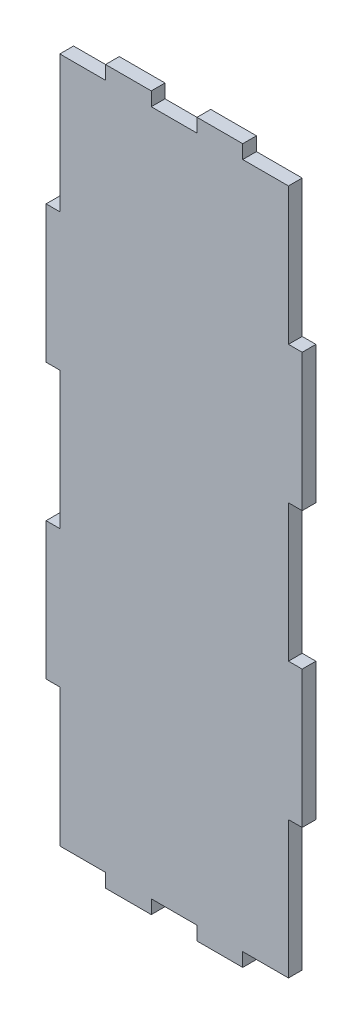
ISO-10303-21;
HEADER;
FILE_DESCRIPTION(('STEP AP214'),'2;1');
FILE_NAME('part.step','',(''),(''),'','','');
FILE_SCHEMA(('AUTOMOTIVE_DESIGN { 1 0 10303 214 1 1 1 1 }'));
ENDSEC;
DATA;
#1=APPLICATION_CONTEXT('core data for automotive mechanical design processes');
#2=APPLICATION_PROTOCOL_DEFINITION('international standard','automotive_design',2000,#1);
#3=PRODUCT_CONTEXT('',#1,'mechanical');
#4=PRODUCT('Part','Part','',(#3));
#5=PRODUCT_RELATED_PRODUCT_CATEGORY('part','',(#4));
#6=PRODUCT_DEFINITION_FORMATION('','',#4);
#7=PRODUCT_DEFINITION_CONTEXT('part definition',#1,'design');
#8=PRODUCT_DEFINITION('design','',#6,#7);
#9=PRODUCT_DEFINITION_SHAPE('','',#8);
#10=(LENGTH_UNIT() NAMED_UNIT(*) SI_UNIT(.MILLI.,.METRE.));
#11=(NAMED_UNIT(*) PLANE_ANGLE_UNIT() SI_UNIT($,.RADIAN.));
#12=(NAMED_UNIT(*) SI_UNIT($,.STERADIAN.) SOLID_ANGLE_UNIT());
#13=UNCERTAINTY_MEASURE_WITH_UNIT(LENGTH_MEASURE(1.E-05),#10,'distance_accuracy_value','');
#14=(GEOMETRIC_REPRESENTATION_CONTEXT(3) GLOBAL_UNCERTAINTY_ASSIGNED_CONTEXT((#13)) GLOBAL_UNIT_ASSIGNED_CONTEXT((#10,
#11,#12)) REPRESENTATION_CONTEXT('',''));
#15=CARTESIAN_POINT('',(0.,0.,0.));
#16=DIRECTION('',(0.,0.,1.));
#17=DIRECTION('',(1.,0.,0.));
#18=AXIS2_PLACEMENT_3D('',#15,#16,#17);
#19=CARTESIAN_POINT('',(40.,-110.677979206516,3.));
#20=DIRECTION('',(0.,1.,0.));
#21=DIRECTION('',(-1.,0.,0.));
#22=AXIS2_PLACEMENT_3D('',#19,#20,#21);
#23=PLANE('',#22);
#24=DIRECTION('',(1.,0.,0.));
#25=VECTOR('',#24,1.);
#26=CARTESIAN_POINT('',(40.,-110.677979206516,0.));
#27=LINE('',#26,#25);
#28=CARTESIAN_POINT('',(30.,-110.677979206516,0.));
#29=VERTEX_POINT('',#28);
#30=CARTESIAN_POINT('',(40.,-110.677979206516,0.));
#31=VERTEX_POINT('',#30);
#32=EDGE_CURVE('E302',#29,#31,#27,.T.);
#33=ORIENTED_EDGE('',*,*,#32,.T.);
#34=DIRECTION('',(0.,0.,-1.));
#35=VECTOR('',#34,1.);
#36=CARTESIAN_POINT('',(40.,-110.677979206516,3.));
#37=LINE('',#36,#35);
#38=CARTESIAN_POINT('',(40.,-110.677979206516,3.));
#39=VERTEX_POINT('',#38);
#40=EDGE_CURVE('E11',#39,#31,#37,.T.);
#41=ORIENTED_EDGE('',*,*,#40,.F.);
#42=DIRECTION('',(1.,0.,0.));
#43=VECTOR('',#42,1.);
#44=CARTESIAN_POINT('',(40.,-110.677979206516,3.));
#45=LINE('',#44,#43);
#46=CARTESIAN_POINT('',(30.,-110.677979206516,3.));
#47=VERTEX_POINT('',#46);
#48=EDGE_CURVE('E372',#47,#39,#45,.T.);
#49=ORIENTED_EDGE('',*,*,#48,.F.);
#50=DIRECTION('',(0.,0.,-1.));
#51=VECTOR('',#50,1.);
#52=CARTESIAN_POINT('',(30.,-110.677979206516,3.));
#53=LINE('',#52,#51);
#54=EDGE_CURVE('E298',#47,#29,#53,.T.);
#55=ORIENTED_EDGE('',*,*,#54,.T.);
#56=EDGE_LOOP('',(#33,#41,#49,#55));
#57=FACE_BOUND('',#56,.T.);
#58=ADVANCED_FACE('F38',(#57),#23,.F.);
#59=CARTESIAN_POINT('',(40.,-80.6779792065165,3.));
#60=DIRECTION('',(-1.,0.,0.));
#61=DIRECTION('',(0.,0.,1.));
#62=AXIS2_PLACEMENT_3D('',#59,#60,#61);
#63=PLANE('',#62);
#64=DIRECTION('',(0.,1.,0.));
#65=VECTOR('',#64,1.);
#66=CARTESIAN_POINT('',(40.,-80.6779792065165,0.));
#67=LINE('',#66,#65);
#68=CARTESIAN_POINT('',(40.,-80.6779792065165,0.));
#69=VERTEX_POINT('',#68);
#70=EDGE_CURVE('E305',#31,#69,#67,.T.);
#71=ORIENTED_EDGE('',*,*,#70,.T.);
#72=DIRECTION('',(0.,0.,-1.));
#73=VECTOR('',#72,1.);
#74=CARTESIAN_POINT('',(40.,-80.6779792065165,3.));
#75=LINE('',#74,#73);
#76=CARTESIAN_POINT('',(40.,-80.6779792065165,3.));
#77=VERTEX_POINT('',#76);
#78=EDGE_CURVE('E46',#77,#69,#75,.T.);
#79=ORIENTED_EDGE('',*,*,#78,.F.);
#80=DIRECTION('',(0.,1.,0.));
#81=VECTOR('',#80,1.);
#82=CARTESIAN_POINT('',(40.,-80.6779792065165,3.));
#83=LINE('',#82,#81);
#84=EDGE_CURVE('E181',#39,#77,#83,.T.);
#85=ORIENTED_EDGE('',*,*,#84,.F.);
#86=ORIENTED_EDGE('',*,*,#40,.T.);
#87=EDGE_LOOP('',(#71,#79,#85,#86));
#88=FACE_BOUND('',#87,.T.);
#89=ADVANCED_FACE('F570',(#88),#63,.F.);
#90=CARTESIAN_POINT('',(40.,-80.6779792065165,3.));
#91=DIRECTION('',(0.,1.,0.));
#92=DIRECTION('',(0.,0.,1.));
#93=AXIS2_PLACEMENT_3D('',#90,#91,#92);
#94=PLANE('',#93);
#95=DIRECTION('',(1.,0.,0.));
#96=VECTOR('',#95,1.);
#97=CARTESIAN_POINT('',(40.,-80.6779792065165,0.));
#98=LINE('',#97,#96);
#99=CARTESIAN_POINT('',(43.,-80.6779792065165,0.));
#100=VERTEX_POINT('',#99);
#101=EDGE_CURVE('E307',#69,#100,#98,.T.);
#102=ORIENTED_EDGE('',*,*,#101,.T.);
#103=DIRECTION('',(0.,0.,-1.));
#104=VECTOR('',#103,1.);
#105=CARTESIAN_POINT('',(43.,-80.6779792065165,3.));
#106=LINE('',#105,#104);
#107=CARTESIAN_POINT('',(43.,-80.6779792065165,3.));
#108=VERTEX_POINT('',#107);
#109=EDGE_CURVE('E463',#108,#100,#106,.T.);
#110=ORIENTED_EDGE('',*,*,#109,.F.);
#111=DIRECTION('',(1.,0.,0.));
#112=VECTOR('',#111,1.);
#113=CARTESIAN_POINT('',(40.,-80.6779792065165,3.));
#114=LINE('',#113,#112);
#115=EDGE_CURVE('E471',#77,#108,#114,.T.);
#116=ORIENTED_EDGE('',*,*,#115,.F.);
#117=ORIENTED_EDGE('',*,*,#78,.T.);
#118=EDGE_LOOP('',(#102,#110,#116,#117));
#119=FACE_BOUND('',#118,.T.);
#120=ADVANCED_FACE('F469',(#119),#94,.F.);
#121=CARTESIAN_POINT('',(43.,-80.6779792065165,3.));
#122=DIRECTION('',(-1.,0.,0.));
#123=DIRECTION('',(0.,-1.,0.));
#124=AXIS2_PLACEMENT_3D('',#121,#122,#123);
#125=PLANE('',#124);
#126=DIRECTION('',(0.,1.,0.));
#127=VECTOR('',#126,1.);
#128=CARTESIAN_POINT('',(43.,-80.6779792065165,0.));
#129=LINE('',#128,#127);
#130=CARTESIAN_POINT('',(43.,-50.6779792065165,0.));
#131=VERTEX_POINT('',#130);
#132=EDGE_CURVE('E309',#100,#131,#129,.T.);
#133=ORIENTED_EDGE('',*,*,#132,.T.);
#134=DIRECTION('',(0.,0.,-1.));
#135=VECTOR('',#134,1.);
#136=CARTESIAN_POINT('',(43.,-50.6779792065165,3.));
#137=LINE('',#136,#135);
#138=CARTESIAN_POINT('',(43.,-50.6779792065165,3.));
#139=VERTEX_POINT('',#138);
#140=EDGE_CURVE('E460',#139,#131,#137,.T.);
#141=ORIENTED_EDGE('',*,*,#140,.F.);
#142=DIRECTION('',(0.,1.,0.));
#143=VECTOR('',#142,1.);
#144=CARTESIAN_POINT('',(43.,-80.6779792065165,3.));
#145=LINE('',#144,#143);
#146=EDGE_CURVE('E489',#108,#139,#145,.T.);
#147=ORIENTED_EDGE('',*,*,#146,.F.);
#148=ORIENTED_EDGE('',*,*,#109,.T.);
#149=EDGE_LOOP('',(#133,#141,#147,#148));
#150=FACE_BOUND('',#149,.T.);
#151=ADVANCED_FACE('F480',(#150),#125,.F.);
#152=CARTESIAN_POINT('',(40.,-50.6779792065165,3.));
#153=DIRECTION('',(0.,-1.,0.));
#154=DIRECTION('',(0.,0.,-1.));
#155=AXIS2_PLACEMENT_3D('',#152,#153,#154);
#156=PLANE('',#155);
#157=DIRECTION('',(-1.,0.,0.));
#158=VECTOR('',#157,1.);
#159=CARTESIAN_POINT('',(40.,-50.6779792065165,0.));
#160=LINE('',#159,#158);
#161=CARTESIAN_POINT('',(40.,-50.6779792065165,0.));
#162=VERTEX_POINT('',#161);
#163=EDGE_CURVE('E311',#131,#162,#160,.T.);
#164=ORIENTED_EDGE('',*,*,#163,.T.);
#165=DIRECTION('',(0.,0.,-1.));
#166=VECTOR('',#165,1.);
#167=CARTESIAN_POINT('',(40.,-50.6779792065165,3.));
#168=LINE('',#167,#166);
#169=CARTESIAN_POINT('',(40.,-50.6779792065165,3.));
#170=VERTEX_POINT('',#169);
#171=EDGE_CURVE('E457',#170,#162,#168,.T.);
#172=ORIENTED_EDGE('',*,*,#171,.F.);
#173=DIRECTION('',(-1.,0.,0.));
#174=VECTOR('',#173,1.);
#175=CARTESIAN_POINT('',(40.,-50.6779792065165,3.));
#176=LINE('',#175,#174);
#177=EDGE_CURVE('E486',#139,#170,#176,.T.);
#178=ORIENTED_EDGE('',*,*,#177,.F.);
#179=ORIENTED_EDGE('',*,*,#140,.T.);
#180=EDGE_LOOP('',(#164,#172,#178,#179));
#181=FACE_BOUND('',#180,.T.);
#182=ADVANCED_FACE('F484',(#181),#156,.F.);
#183=CARTESIAN_POINT('',(40.,-20.6779792065165,3.));
#184=DIRECTION('',(-1.,0.,0.));
#185=DIRECTION('',(0.,0.,1.));
#186=AXIS2_PLACEMENT_3D('',#183,#184,#185);
#187=PLANE('',#186);
#188=DIRECTION('',(0.,1.,0.));
#189=VECTOR('',#188,1.);
#190=CARTESIAN_POINT('',(40.,-20.6779792065165,0.));
#191=LINE('',#190,#189);
#192=CARTESIAN_POINT('',(40.,-20.6779792065165,0.));
#193=VERTEX_POINT('',#192);
#194=EDGE_CURVE('E313',#162,#193,#191,.T.);
#195=ORIENTED_EDGE('',*,*,#194,.T.);
#196=DIRECTION('',(0.,0.,-1.));
#197=VECTOR('',#196,1.);
#198=CARTESIAN_POINT('',(40.,-20.6779792065165,3.));
#199=LINE('',#198,#197);
#200=CARTESIAN_POINT('',(40.,-20.6779792065165,3.));
#201=VERTEX_POINT('',#200);
#202=EDGE_CURVE('E454',#201,#193,#199,.T.);
#203=ORIENTED_EDGE('',*,*,#202,.F.);
#204=DIRECTION('',(0.,1.,0.));
#205=VECTOR('',#204,1.);
#206=CARTESIAN_POINT('',(40.,-20.6779792065165,3.));
#207=LINE('',#206,#205);
#208=EDGE_CURVE('E488',#170,#201,#207,.T.);
#209=ORIENTED_EDGE('',*,*,#208,.F.);
#210=ORIENTED_EDGE('',*,*,#171,.T.);
#211=EDGE_LOOP('',(#195,#203,#209,#210));
#212=FACE_BOUND('',#211,.T.);
#213=ADVANCED_FACE('F583',(#212),#187,.F.);
#214=CARTESIAN_POINT('',(40.,-20.6779792065165,3.));
#215=DIRECTION('',(0.,1.,0.));
#216=DIRECTION('',(0.,0.,1.));
#217=AXIS2_PLACEMENT_3D('',#214,#215,#216);
#218=PLANE('',#217);
#219=DIRECTION('',(1.,0.,0.));
#220=VECTOR('',#219,1.);
#221=CARTESIAN_POINT('',(40.,-20.6779792065165,0.));
#222=LINE('',#221,#220);
#223=CARTESIAN_POINT('',(43.,-20.6779792065165,0.));
#224=VERTEX_POINT('',#223);
#225=EDGE_CURVE('E315',#193,#224,#222,.T.);
#226=ORIENTED_EDGE('',*,*,#225,.T.);
#227=DIRECTION('',(0.,0.,-1.));
#228=VECTOR('',#227,1.);
#229=CARTESIAN_POINT('',(43.,-20.6779792065165,3.));
#230=LINE('',#229,#228);
#231=CARTESIAN_POINT('',(43.,-20.6779792065165,3.));
#232=VERTEX_POINT('',#231);
#233=EDGE_CURVE('E451',#232,#224,#230,.T.);
#234=ORIENTED_EDGE('',*,*,#233,.F.);
#235=DIRECTION('',(1.,0.,0.));
#236=VECTOR('',#235,1.);
#237=CARTESIAN_POINT('',(40.,-20.6779792065165,3.));
#238=LINE('',#237,#236);
#239=EDGE_CURVE('E491',#201,#232,#238,.T.);
#240=ORIENTED_EDGE('',*,*,#239,.F.);
#241=ORIENTED_EDGE('',*,*,#202,.T.);
#242=EDGE_LOOP('',(#226,#234,#240,#241));
#243=FACE_BOUND('',#242,.T.);
#244=ADVANCED_FACE('F586',(#243),#218,.F.);
#245=CARTESIAN_POINT('',(43.,-20.6779792065165,3.));
#246=DIRECTION('',(-1.,0.,0.));
#247=DIRECTION('',(0.,-1.,0.));
#248=AXIS2_PLACEMENT_3D('',#245,#246,#247);
#249=PLANE('',#248);
#250=DIRECTION('',(0.,1.,0.));
#251=VECTOR('',#250,1.);
#252=CARTESIAN_POINT('',(43.,-20.6779792065165,0.));
#253=LINE('',#252,#251);
#254=CARTESIAN_POINT('',(43.,9.32202079348354,0.));
#255=VERTEX_POINT('',#254);
#256=EDGE_CURVE('E317',#224,#255,#253,.T.);
#257=ORIENTED_EDGE('',*,*,#256,.T.);
#258=DIRECTION('',(0.,0.,-1.));
#259=VECTOR('',#258,1.);
#260=CARTESIAN_POINT('',(43.,9.32202079348354,3.));
#261=LINE('',#260,#259);
#262=CARTESIAN_POINT('',(43.,9.32202079348354,3.));
#263=VERTEX_POINT('',#262);
#264=EDGE_CURVE('E448',#263,#255,#261,.T.);
#265=ORIENTED_EDGE('',*,*,#264,.F.);
#266=DIRECTION('',(0.,1.,0.));
#267=VECTOR('',#266,1.);
#268=CARTESIAN_POINT('',(43.,-20.6779792065165,3.));
#269=LINE('',#268,#267);
#270=EDGE_CURVE('E497',#232,#263,#269,.T.);
#271=ORIENTED_EDGE('',*,*,#270,.F.);
#272=ORIENTED_EDGE('',*,*,#233,.T.);
#273=EDGE_LOOP('',(#257,#265,#271,#272));
#274=FACE_BOUND('',#273,.T.);
#275=ADVANCED_FACE('F590',(#274),#249,.F.);
#276=CARTESIAN_POINT('',(40.,9.32202079348353,3.));
#277=DIRECTION('',(0.,-1.,0.));
#278=DIRECTION('',(1.,0.,0.));
#279=AXIS2_PLACEMENT_3D('',#276,#277,#278);
#280=PLANE('',#279);
#281=DIRECTION('',(-1.,0.,0.));
#282=VECTOR('',#281,1.);
#283=CARTESIAN_POINT('',(40.,9.32202079348353,0.));
#284=LINE('',#283,#282);
#285=CARTESIAN_POINT('',(40.,9.32202079348353,0.));
#286=VERTEX_POINT('',#285);
#287=EDGE_CURVE('E319',#255,#286,#284,.T.);
#288=ORIENTED_EDGE('',*,*,#287,.T.);
#289=DIRECTION('',(0.,0.,-1.));
#290=VECTOR('',#289,1.);
#291=CARTESIAN_POINT('',(40.,9.32202079348353,3.));
#292=LINE('',#291,#290);
#293=CARTESIAN_POINT('',(40.,9.32202079348353,3.));
#294=VERTEX_POINT('',#293);
#295=EDGE_CURVE('E445',#294,#286,#292,.T.);
#296=ORIENTED_EDGE('',*,*,#295,.F.);
#297=DIRECTION('',(-1.,0.,0.));
#298=VECTOR('',#297,1.);
#299=CARTESIAN_POINT('',(40.,9.32202079348353,3.));
#300=LINE('',#299,#298);
#301=EDGE_CURVE('E499',#263,#294,#300,.T.);
#302=ORIENTED_EDGE('',*,*,#301,.F.);
#303=ORIENTED_EDGE('',*,*,#264,.T.);
#304=EDGE_LOOP('',(#288,#296,#302,#303));
#305=FACE_BOUND('',#304,.T.);
#306=ADVANCED_FACE('F594',(#305),#280,.F.);
#307=CARTESIAN_POINT('',(40.,39.3220207934835,3.));
#308=DIRECTION('',(-1.,0.,0.));
#309=DIRECTION('',(0.,0.,1.));
#310=AXIS2_PLACEMENT_3D('',#307,#308,#309);
#311=PLANE('',#310);
#312=DIRECTION('',(0.,1.,0.));
#313=VECTOR('',#312,1.);
#314=CARTESIAN_POINT('',(40.,39.3220207934835,0.));
#315=LINE('',#314,#313);
#316=CARTESIAN_POINT('',(40.,39.3220207934835,0.));
#317=VERTEX_POINT('',#316);
#318=EDGE_CURVE('E321',#286,#317,#315,.T.);
#319=ORIENTED_EDGE('',*,*,#318,.T.);
#320=DIRECTION('',(0.,0.,-1.));
#321=VECTOR('',#320,1.);
#322=CARTESIAN_POINT('',(40.,39.3220207934835,3.));
#323=LINE('',#322,#321);
#324=CARTESIAN_POINT('',(40.,39.3220207934835,3.));
#325=VERTEX_POINT('',#324);
#326=EDGE_CURVE('E442',#325,#317,#323,.T.);
#327=ORIENTED_EDGE('',*,*,#326,.F.);
#328=DIRECTION('',(0.,1.,0.));
#329=VECTOR('',#328,1.);
#330=CARTESIAN_POINT('',(40.,39.3220207934835,3.));
#331=LINE('',#330,#329);
#332=EDGE_CURVE('E501',#294,#325,#331,.T.);
#333=ORIENTED_EDGE('',*,*,#332,.F.);
#334=ORIENTED_EDGE('',*,*,#295,.T.);
#335=EDGE_LOOP('',(#319,#327,#333,#334));
#336=FACE_BOUND('',#335,.T.);
#337=ADVANCED_FACE('F598',(#336),#311,.F.);
#338=CARTESIAN_POINT('',(30.,39.3220207934835,3.));
#339=DIRECTION('',(0.,-1.,0.));
#340=DIRECTION('',(0.,0.,-1.));
#341=AXIS2_PLACEMENT_3D('',#338,#339,#340);
#342=PLANE('',#341);
#343=DIRECTION('',(-1.,0.,0.));
#344=VECTOR('',#343,1.);
#345=CARTESIAN_POINT('',(30.,39.3220207934835,0.));
#346=LINE('',#345,#344);
#347=CARTESIAN_POINT('',(30.,39.3220207934835,0.));
#348=VERTEX_POINT('',#347);
#349=EDGE_CURVE('E323',#317,#348,#346,.T.);
#350=ORIENTED_EDGE('',*,*,#349,.T.);
#351=DIRECTION('',(0.,0.,-1.));
#352=VECTOR('',#351,1.);
#353=CARTESIAN_POINT('',(30.,39.3220207934835,3.));
#354=LINE('',#353,#352);
#355=CARTESIAN_POINT('',(30.,39.3220207934835,3.));
#356=VERTEX_POINT('',#355);
#357=EDGE_CURVE('E439',#356,#348,#354,.T.);
#358=ORIENTED_EDGE('',*,*,#357,.F.);
#359=DIRECTION('',(-1.,0.,0.));
#360=VECTOR('',#359,1.);
#361=CARTESIAN_POINT('',(30.,39.3220207934835,3.));
#362=LINE('',#361,#360);
#363=EDGE_CURVE('E503',#325,#356,#362,.T.);
#364=ORIENTED_EDGE('',*,*,#363,.F.);
#365=ORIENTED_EDGE('',*,*,#326,.T.);
#366=EDGE_LOOP('',(#350,#358,#364,#365));
#367=FACE_BOUND('',#366,.T.);
#368=ADVANCED_FACE('F602',(#367),#342,.F.);
#369=CARTESIAN_POINT('',(30.,42.3220207934835,3.));
#370=DIRECTION('',(-1.,0.,0.));
#371=DIRECTION('',(0.,0.,1.));
#372=AXIS2_PLACEMENT_3D('',#369,#370,#371);
#373=PLANE('',#372);
#374=DIRECTION('',(0.,1.,0.));
#375=VECTOR('',#374,1.);
#376=CARTESIAN_POINT('',(30.,42.3220207934835,0.));
#377=LINE('',#376,#375);
#378=CARTESIAN_POINT('',(30.,42.3220207934835,0.));
#379=VERTEX_POINT('',#378);
#380=EDGE_CURVE('E325',#348,#379,#377,.T.);
#381=ORIENTED_EDGE('',*,*,#380,.T.);
#382=DIRECTION('',(0.,0.,-1.));
#383=VECTOR('',#382,1.);
#384=CARTESIAN_POINT('',(30.,42.3220207934835,3.));
#385=LINE('',#384,#383);
#386=CARTESIAN_POINT('',(30.,42.3220207934835,3.));
#387=VERTEX_POINT('',#386);
#388=EDGE_CURVE('E436',#387,#379,#385,.T.);
#389=ORIENTED_EDGE('',*,*,#388,.F.);
#390=DIRECTION('',(0.,1.,0.));
#391=VECTOR('',#390,1.);
#392=CARTESIAN_POINT('',(30.,42.3220207934835,3.));
#393=LINE('',#392,#391);
#394=EDGE_CURVE('E505',#356,#387,#393,.T.);
#395=ORIENTED_EDGE('',*,*,#394,.F.);
#396=ORIENTED_EDGE('',*,*,#357,.T.);
#397=EDGE_LOOP('',(#381,#389,#395,#396));
#398=FACE_BOUND('',#397,.T.);
#399=ADVANCED_FACE('F606',(#398),#373,.F.);
#400=CARTESIAN_POINT('',(30.,42.3220207934835,3.));
#401=DIRECTION('',(0.,-1.,0.));
#402=DIRECTION('',(1.,0.,0.));
#403=AXIS2_PLACEMENT_3D('',#400,#401,#402);
#404=PLANE('',#403);
#405=DIRECTION('',(-1.,0.,0.));
#406=VECTOR('',#405,1.);
#407=CARTESIAN_POINT('',(30.,42.3220207934835,0.));
#408=LINE('',#407,#406);
#409=CARTESIAN_POINT('',(20.,42.3220207934835,0.));
#410=VERTEX_POINT('',#409);
#411=EDGE_CURVE('E327',#379,#410,#408,.T.);
#412=ORIENTED_EDGE('',*,*,#411,.T.);
#413=DIRECTION('',(0.,0.,-1.));
#414=VECTOR('',#413,1.);
#415=CARTESIAN_POINT('',(20.,42.3220207934835,3.));
#416=LINE('',#415,#414);
#417=CARTESIAN_POINT('',(20.,42.3220207934835,3.));
#418=VERTEX_POINT('',#417);
#419=EDGE_CURVE('E433',#418,#410,#416,.T.);
#420=ORIENTED_EDGE('',*,*,#419,.F.);
#421=DIRECTION('',(-1.,0.,0.));
#422=VECTOR('',#421,1.);
#423=CARTESIAN_POINT('',(30.,42.3220207934835,3.));
#424=LINE('',#423,#422);
#425=EDGE_CURVE('E507',#387,#418,#424,.T.);
#426=ORIENTED_EDGE('',*,*,#425,.F.);
#427=ORIENTED_EDGE('',*,*,#388,.T.);
#428=EDGE_LOOP('',(#412,#420,#426,#427));
#429=FACE_BOUND('',#428,.T.);
#430=ADVANCED_FACE('F610',(#429),#404,.F.);
#431=CARTESIAN_POINT('',(20.,39.3220207934835,3.));
#432=DIRECTION('',(1.,0.,0.));
#433=DIRECTION('',(0.,0.,-1.));
#434=AXIS2_PLACEMENT_3D('',#431,#432,#433);
#435=PLANE('',#434);
#436=DIRECTION('',(0.,-1.,0.));
#437=VECTOR('',#436,1.);
#438=CARTESIAN_POINT('',(20.,39.3220207934835,0.));
#439=LINE('',#438,#437);
#440=CARTESIAN_POINT('',(20.,39.3220207934835,0.));
#441=VERTEX_POINT('',#440);
#442=EDGE_CURVE('E329',#410,#441,#439,.T.);
#443=ORIENTED_EDGE('',*,*,#442,.T.);
#444=DIRECTION('',(0.,0.,-1.));
#445=VECTOR('',#444,1.);
#446=CARTESIAN_POINT('',(20.,39.3220207934835,3.));
#447=LINE('',#446,#445);
#448=CARTESIAN_POINT('',(20.,39.3220207934835,3.));
#449=VERTEX_POINT('',#448);
#450=EDGE_CURVE('E430',#449,#441,#447,.T.);
#451=ORIENTED_EDGE('',*,*,#450,.F.);
#452=DIRECTION('',(0.,-1.,0.));
#453=VECTOR('',#452,1.);
#454=CARTESIAN_POINT('',(20.,39.3220207934835,3.));
#455=LINE('',#454,#453);
#456=EDGE_CURVE('E509',#418,#449,#455,.T.);
#457=ORIENTED_EDGE('',*,*,#456,.F.);
#458=ORIENTED_EDGE('',*,*,#419,.T.);
#459=EDGE_LOOP('',(#443,#451,#457,#458));
#460=FACE_BOUND('',#459,.T.);
#461=ADVANCED_FACE('F614',(#460),#435,.F.);
#462=CARTESIAN_POINT('',(10.,39.3220207934835,3.));
#463=DIRECTION('',(0.,-1.,0.));
#464=DIRECTION('',(0.,0.,-1.));
#465=AXIS2_PLACEMENT_3D('',#462,#463,#464);
#466=PLANE('',#465);
#467=DIRECTION('',(-1.,0.,0.));
#468=VECTOR('',#467,1.);
#469=CARTESIAN_POINT('',(10.,39.3220207934835,0.));
#470=LINE('',#469,#468);
#471=CARTESIAN_POINT('',(10.,39.3220207934835,0.));
#472=VERTEX_POINT('',#471);
#473=EDGE_CURVE('E331',#441,#472,#470,.T.);
#474=ORIENTED_EDGE('',*,*,#473,.T.);
#475=DIRECTION('',(0.,0.,-1.));
#476=VECTOR('',#475,1.);
#477=CARTESIAN_POINT('',(10.,39.3220207934835,3.));
#478=LINE('',#477,#476);
#479=CARTESIAN_POINT('',(10.,39.3220207934835,3.));
#480=VERTEX_POINT('',#479);
#481=EDGE_CURVE('E427',#480,#472,#478,.T.);
#482=ORIENTED_EDGE('',*,*,#481,.F.);
#483=DIRECTION('',(-1.,0.,0.));
#484=VECTOR('',#483,1.);
#485=CARTESIAN_POINT('',(10.,39.3220207934835,3.));
#486=LINE('',#485,#484);
#487=EDGE_CURVE('E511',#449,#480,#486,.T.);
#488=ORIENTED_EDGE('',*,*,#487,.F.);
#489=ORIENTED_EDGE('',*,*,#450,.T.);
#490=EDGE_LOOP('',(#474,#482,#488,#489));
#491=FACE_BOUND('',#490,.T.);
#492=ADVANCED_FACE('F618',(#491),#466,.F.);
#493=CARTESIAN_POINT('',(10.,42.3220207934835,3.));
#494=DIRECTION('',(-1.,0.,0.));
#495=DIRECTION('',(0.,0.,1.));
#496=AXIS2_PLACEMENT_3D('',#493,#494,#495);
#497=PLANE('',#496);
#498=DIRECTION('',(0.,1.,0.));
#499=VECTOR('',#498,1.);
#500=CARTESIAN_POINT('',(10.,42.3220207934835,0.));
#501=LINE('',#500,#499);
#502=CARTESIAN_POINT('',(10.,42.3220207934835,0.));
#503=VERTEX_POINT('',#502);
#504=EDGE_CURVE('E333',#472,#503,#501,.T.);
#505=ORIENTED_EDGE('',*,*,#504,.T.);
#506=DIRECTION('',(0.,0.,-1.));
#507=VECTOR('',#506,1.);
#508=CARTESIAN_POINT('',(10.,42.3220207934835,3.));
#509=LINE('',#508,#507);
#510=CARTESIAN_POINT('',(10.,42.3220207934835,3.));
#511=VERTEX_POINT('',#510);
#512=EDGE_CURVE('E424',#511,#503,#509,.T.);
#513=ORIENTED_EDGE('',*,*,#512,.F.);
#514=DIRECTION('',(0.,1.,0.));
#515=VECTOR('',#514,1.);
#516=CARTESIAN_POINT('',(10.,42.3220207934835,3.));
#517=LINE('',#516,#515);
#518=EDGE_CURVE('E513',#480,#511,#517,.T.);
#519=ORIENTED_EDGE('',*,*,#518,.F.);
#520=ORIENTED_EDGE('',*,*,#481,.T.);
#521=EDGE_LOOP('',(#505,#513,#519,#520));
#522=FACE_BOUND('',#521,.T.);
#523=ADVANCED_FACE('F622',(#522),#497,.F.);
#524=CARTESIAN_POINT('',(10.,42.3220207934835,3.));
#525=DIRECTION('',(0.,-1.,0.));
#526=DIRECTION('',(1.,0.,0.));
#527=AXIS2_PLACEMENT_3D('',#524,#525,#526);
#528=PLANE('',#527);
#529=DIRECTION('',(-1.,0.,0.));
#530=VECTOR('',#529,1.);
#531=CARTESIAN_POINT('',(10.,42.3220207934835,0.));
#532=LINE('',#531,#530);
#533=CARTESIAN_POINT('',(0.,42.3220207934835,0.));
#534=VERTEX_POINT('',#533);
#535=EDGE_CURVE('E335',#503,#534,#532,.T.);
#536=ORIENTED_EDGE('',*,*,#535,.T.);
#537=DIRECTION('',(0.,0.,-1.));
#538=VECTOR('',#537,1.);
#539=CARTESIAN_POINT('',(0.,42.3220207934835,3.));
#540=LINE('',#539,#538);
#541=CARTESIAN_POINT('',(0.,42.3220207934835,3.));
#542=VERTEX_POINT('',#541);
#543=EDGE_CURVE('E421',#542,#534,#540,.T.);
#544=ORIENTED_EDGE('',*,*,#543,.F.);
#545=DIRECTION('',(-1.,0.,0.));
#546=VECTOR('',#545,1.);
#547=CARTESIAN_POINT('',(10.,42.3220207934835,3.));
#548=LINE('',#547,#546);
#549=EDGE_CURVE('E515',#511,#542,#548,.T.);
#550=ORIENTED_EDGE('',*,*,#549,.F.);
#551=ORIENTED_EDGE('',*,*,#512,.T.);
#552=EDGE_LOOP('',(#536,#544,#550,#551));
#553=FACE_BOUND('',#552,.T.);
#554=ADVANCED_FACE('F626',(#553),#528,.F.);
#555=CARTESIAN_POINT('',(0.,39.3220207934835,3.));
#556=DIRECTION('',(1.,0.,0.));
#557=DIRECTION('',(0.,0.,-1.));
#558=AXIS2_PLACEMENT_3D('',#555,#556,#557);
#559=PLANE('',#558);
#560=DIRECTION('',(0.,-1.,0.));
#561=VECTOR('',#560,1.);
#562=CARTESIAN_POINT('',(0.,39.3220207934835,0.));
#563=LINE('',#562,#561);
#564=CARTESIAN_POINT('',(0.,39.3220207934835,0.));
#565=VERTEX_POINT('',#564);
#566=EDGE_CURVE('E337',#534,#565,#563,.T.);
#567=ORIENTED_EDGE('',*,*,#566,.T.);
#568=DIRECTION('',(0.,0.,-1.));
#569=VECTOR('',#568,1.);
#570=CARTESIAN_POINT('',(0.,39.3220207934835,3.));
#571=LINE('',#570,#569);
#572=CARTESIAN_POINT('',(0.,39.3220207934835,3.));
#573=VERTEX_POINT('',#572);
#574=EDGE_CURVE('E418',#573,#565,#571,.T.);
#575=ORIENTED_EDGE('',*,*,#574,.F.);
#576=DIRECTION('',(0.,-1.,0.));
#577=VECTOR('',#576,1.);
#578=CARTESIAN_POINT('',(0.,39.3220207934835,3.));
#579=LINE('',#578,#577);
#580=EDGE_CURVE('E517',#542,#573,#579,.T.);
#581=ORIENTED_EDGE('',*,*,#580,.F.);
#582=ORIENTED_EDGE('',*,*,#543,.T.);
#583=EDGE_LOOP('',(#567,#575,#581,#582));
#584=FACE_BOUND('',#583,.T.);
#585=ADVANCED_FACE('F630',(#584),#559,.F.);
#586=CARTESIAN_POINT('',(0.,39.3220207934835,3.));
#587=DIRECTION('',(0.,-1.,0.));
#588=DIRECTION('',(0.,0.,-1.));
#589=AXIS2_PLACEMENT_3D('',#586,#587,#588);
#590=PLANE('',#589);
#591=DIRECTION('',(-1.,0.,0.));
#592=VECTOR('',#591,1.);
#593=CARTESIAN_POINT('',(0.,39.3220207934835,0.));
#594=LINE('',#593,#592);
#595=CARTESIAN_POINT('',(-10.,39.3220207934835,0.));
#596=VERTEX_POINT('',#595);
#597=EDGE_CURVE('E339',#565,#596,#594,.T.);
#598=ORIENTED_EDGE('',*,*,#597,.T.);
#599=DIRECTION('',(0.,0.,-1.));
#600=VECTOR('',#599,1.);
#601=CARTESIAN_POINT('',(-10.,39.3220207934835,3.));
#602=LINE('',#601,#600);
#603=CARTESIAN_POINT('',(-10.,39.3220207934835,3.));
#604=VERTEX_POINT('',#603);
#605=EDGE_CURVE('E415',#604,#596,#602,.T.);
#606=ORIENTED_EDGE('',*,*,#605,.F.);
#607=DIRECTION('',(-1.,0.,0.));
#608=VECTOR('',#607,1.);
#609=CARTESIAN_POINT('',(0.,39.3220207934835,3.));
#610=LINE('',#609,#608);
#611=EDGE_CURVE('E519',#573,#604,#610,.T.);
#612=ORIENTED_EDGE('',*,*,#611,.F.);
#613=ORIENTED_EDGE('',*,*,#574,.T.);
#614=EDGE_LOOP('',(#598,#606,#612,#613));
#615=FACE_BOUND('',#614,.T.);
#616=ADVANCED_FACE('F634',(#615),#590,.F.);
#617=CARTESIAN_POINT('',(-10.,39.3220207934835,3.));
#618=DIRECTION('',(1.,0.,0.));
#619=DIRECTION('',(0.,1.,0.));
#620=AXIS2_PLACEMENT_3D('',#617,#618,#619);
#621=PLANE('',#620);
#622=DIRECTION('',(0.,-1.,0.));
#623=VECTOR('',#622,1.);
#624=CARTESIAN_POINT('',(-10.,39.3220207934835,0.));
#625=LINE('',#624,#623);
#626=CARTESIAN_POINT('',(-9.99999999999999,9.43218156127861,0.));
#627=VERTEX_POINT('',#626);
#628=EDGE_CURVE('E341',#596,#627,#625,.T.);
#629=ORIENTED_EDGE('',*,*,#628,.T.);
#630=DIRECTION('',(0.,0.,-1.));
#631=VECTOR('',#630,1.);
#632=CARTESIAN_POINT('',(-9.99999999999999,9.43218156127861,3.));
#633=LINE('',#632,#631);
#634=CARTESIAN_POINT('',(-9.99999999999999,9.43218156127861,3.));
#635=VERTEX_POINT('',#634);
#636=EDGE_CURVE('E412',#635,#627,#633,.T.);
#637=ORIENTED_EDGE('',*,*,#636,.F.);
#638=DIRECTION('',(0.,-1.,0.));
#639=VECTOR('',#638,1.);
#640=CARTESIAN_POINT('',(-10.,39.3220207934835,3.));
#641=LINE('',#640,#639);
#642=EDGE_CURVE('E521',#604,#635,#641,.T.);
#643=ORIENTED_EDGE('',*,*,#642,.F.);
#644=ORIENTED_EDGE('',*,*,#605,.T.);
#645=EDGE_LOOP('',(#629,#637,#643,#644));
#646=FACE_BOUND('',#645,.T.);
#647=ADVANCED_FACE('F638',(#646),#621,.F.);
#648=CARTESIAN_POINT('',(-9.99999999999999,9.43218156127861,3.));
#649=DIRECTION('',(0.,-1.,0.));
#650=DIRECTION('',(0.,0.,-1.));
#651=AXIS2_PLACEMENT_3D('',#648,#649,#650);
#652=PLANE('',#651);
#653=DIRECTION('',(-1.,0.,0.));
#654=VECTOR('',#653,1.);
#655=CARTESIAN_POINT('',(-9.99999999999999,9.43218156127861,0.));
#656=LINE('',#655,#654);
#657=CARTESIAN_POINT('',(-13.,9.43218156127861,0.));
#658=VERTEX_POINT('',#657);
#659=EDGE_CURVE('E343',#627,#658,#656,.T.);
#660=ORIENTED_EDGE('',*,*,#659,.T.);
#661=DIRECTION('',(0.,0.,-1.));
#662=VECTOR('',#661,1.);
#663=CARTESIAN_POINT('',(-13.,9.43218156127861,3.));
#664=LINE('',#663,#662);
#665=CARTESIAN_POINT('',(-13.,9.43218156127861,3.));
#666=VERTEX_POINT('',#665);
#667=EDGE_CURVE('E409',#666,#658,#664,.T.);
#668=ORIENTED_EDGE('',*,*,#667,.F.);
#669=DIRECTION('',(-1.,0.,0.));
#670=VECTOR('',#669,1.);
#671=CARTESIAN_POINT('',(-9.99999999999999,9.43218156127861,3.));
#672=LINE('',#671,#670);
#673=EDGE_CURVE('E523',#635,#666,#672,.T.);
#674=ORIENTED_EDGE('',*,*,#673,.F.);
#675=ORIENTED_EDGE('',*,*,#636,.T.);
#676=EDGE_LOOP('',(#660,#668,#674,#675));
#677=FACE_BOUND('',#676,.T.);
#678=ADVANCED_FACE('F642',(#677),#652,.F.);
#679=CARTESIAN_POINT('',(-13.,-20.5678184387214,3.));
#680=DIRECTION('',(1.,0.,0.));
#681=DIRECTION('',(0.,1.,0.));
#682=AXIS2_PLACEMENT_3D('',#679,#680,#681);
#683=PLANE('',#682);
#684=DIRECTION('',(0.,-1.,0.));
#685=VECTOR('',#684,1.);
#686=CARTESIAN_POINT('',(-13.,-20.5678184387214,0.));
#687=LINE('',#686,#685);
#688=CARTESIAN_POINT('',(-13.,-20.5678184387214,0.));
#689=VERTEX_POINT('',#688);
#690=EDGE_CURVE('E345',#658,#689,#687,.T.);
#691=ORIENTED_EDGE('',*,*,#690,.T.);
#692=DIRECTION('',(0.,0.,-1.));
#693=VECTOR('',#692,1.);
#694=CARTESIAN_POINT('',(-13.,-20.5678184387214,3.));
#695=LINE('',#694,#693);
#696=CARTESIAN_POINT('',(-13.,-20.5678184387214,3.));
#697=VERTEX_POINT('',#696);
#698=EDGE_CURVE('E406',#697,#689,#695,.T.);
#699=ORIENTED_EDGE('',*,*,#698,.F.);
#700=DIRECTION('',(0.,-1.,0.));
#701=VECTOR('',#700,1.);
#702=CARTESIAN_POINT('',(-13.,-20.5678184387214,3.));
#703=LINE('',#702,#701);
#704=EDGE_CURVE('E525',#666,#697,#703,.T.);
#705=ORIENTED_EDGE('',*,*,#704,.F.);
#706=ORIENTED_EDGE('',*,*,#667,.T.);
#707=EDGE_LOOP('',(#691,#699,#705,#706));
#708=FACE_BOUND('',#707,.T.);
#709=ADVANCED_FACE('F646',(#708),#683,.F.);
#710=CARTESIAN_POINT('',(-9.99999999999999,-20.5678184387214,3.));
#711=DIRECTION('',(0.,1.,0.));
#712=DIRECTION('',(-1.,0.,0.));
#713=AXIS2_PLACEMENT_3D('',#710,#711,#712);
#714=PLANE('',#713);
#715=DIRECTION('',(1.,0.,0.));
#716=VECTOR('',#715,1.);
#717=CARTESIAN_POINT('',(-9.99999999999999,-20.5678184387214,0.));
#718=LINE('',#717,#716);
#719=CARTESIAN_POINT('',(-9.99999999999999,-20.5678184387214,0.));
#720=VERTEX_POINT('',#719);
#721=EDGE_CURVE('E347',#689,#720,#718,.T.);
#722=ORIENTED_EDGE('',*,*,#721,.T.);
#723=DIRECTION('',(0.,0.,-1.));
#724=VECTOR('',#723,1.);
#725=CARTESIAN_POINT('',(-9.99999999999999,-20.5678184387214,3.));
#726=LINE('',#725,#724);
#727=CARTESIAN_POINT('',(-9.99999999999999,-20.5678184387214,3.));
#728=VERTEX_POINT('',#727);
#729=EDGE_CURVE('E403',#728,#720,#726,.T.);
#730=ORIENTED_EDGE('',*,*,#729,.F.);
#731=DIRECTION('',(1.,0.,0.));
#732=VECTOR('',#731,1.);
#733=CARTESIAN_POINT('',(-9.99999999999999,-20.5678184387214,3.));
#734=LINE('',#733,#732);
#735=EDGE_CURVE('E527',#697,#728,#734,.T.);
#736=ORIENTED_EDGE('',*,*,#735,.F.);
#737=ORIENTED_EDGE('',*,*,#698,.T.);
#738=EDGE_LOOP('',(#722,#730,#736,#737));
#739=FACE_BOUND('',#738,.T.);
#740=ADVANCED_FACE('F650',(#739),#714,.F.);
#741=CARTESIAN_POINT('',(-9.99999999999999,-20.5678184387214,3.));
#742=DIRECTION('',(1.,0.,0.));
#743=DIRECTION('',(0.,1.,0.));
#744=AXIS2_PLACEMENT_3D('',#741,#742,#743);
#745=PLANE('',#744);
#746=DIRECTION('',(0.,-1.,0.));
#747=VECTOR('',#746,1.);
#748=CARTESIAN_POINT('',(-9.99999999999999,-20.5678184387214,0.));
#749=LINE('',#748,#747);
#750=CARTESIAN_POINT('',(-9.99999999999998,-50.5678184387214,0.));
#751=VERTEX_POINT('',#750);
#752=EDGE_CURVE('E349',#720,#751,#749,.T.);
#753=ORIENTED_EDGE('',*,*,#752,.T.);
#754=DIRECTION('',(0.,0.,-1.));
#755=VECTOR('',#754,1.);
#756=CARTESIAN_POINT('',(-9.99999999999998,-50.5678184387214,3.));
#757=LINE('',#756,#755);
#758=CARTESIAN_POINT('',(-9.99999999999998,-50.5678184387214,3.));
#759=VERTEX_POINT('',#758);
#760=EDGE_CURVE('E400',#759,#751,#757,.T.);
#761=ORIENTED_EDGE('',*,*,#760,.F.);
#762=DIRECTION('',(0.,-1.,0.));
#763=VECTOR('',#762,1.);
#764=CARTESIAN_POINT('',(-9.99999999999999,-20.5678184387214,3.));
#765=LINE('',#764,#763);
#766=EDGE_CURVE('E529',#728,#759,#765,.T.);
#767=ORIENTED_EDGE('',*,*,#766,.F.);
#768=ORIENTED_EDGE('',*,*,#729,.T.);
#769=EDGE_LOOP('',(#753,#761,#767,#768));
#770=FACE_BOUND('',#769,.T.);
#771=ADVANCED_FACE('F654',(#770),#745,.F.);
#772=CARTESIAN_POINT('',(-13.,-50.5678184387214,3.));
#773=DIRECTION('',(0.,-1.,0.));
#774=DIRECTION('',(0.,0.,-1.));
#775=AXIS2_PLACEMENT_3D('',#772,#773,#774);
#776=PLANE('',#775);
#777=DIRECTION('',(-1.,0.,0.));
#778=VECTOR('',#777,1.);
#779=CARTESIAN_POINT('',(-13.,-50.5678184387214,0.));
#780=LINE('',#779,#778);
#781=CARTESIAN_POINT('',(-13.,-50.5678184387214,0.));
#782=VERTEX_POINT('',#781);
#783=EDGE_CURVE('E351',#751,#782,#780,.T.);
#784=ORIENTED_EDGE('',*,*,#783,.T.);
#785=DIRECTION('',(0.,0.,-1.));
#786=VECTOR('',#785,1.);
#787=CARTESIAN_POINT('',(-13.,-50.5678184387214,3.));
#788=LINE('',#787,#786);
#789=CARTESIAN_POINT('',(-13.,-50.5678184387214,3.));
#790=VERTEX_POINT('',#789);
#791=EDGE_CURVE('E397',#790,#782,#788,.T.);
#792=ORIENTED_EDGE('',*,*,#791,.F.);
#793=DIRECTION('',(-1.,0.,0.));
#794=VECTOR('',#793,1.);
#795=CARTESIAN_POINT('',(-13.,-50.5678184387214,3.));
#796=LINE('',#795,#794);
#797=EDGE_CURVE('E531',#759,#790,#796,.T.);
#798=ORIENTED_EDGE('',*,*,#797,.F.);
#799=ORIENTED_EDGE('',*,*,#760,.T.);
#800=EDGE_LOOP('',(#784,#792,#798,#799));
#801=FACE_BOUND('',#800,.T.);
#802=ADVANCED_FACE('F658',(#801),#776,.F.);
#803=CARTESIAN_POINT('',(-13.,-80.5678184387214,3.));
#804=DIRECTION('',(1.,0.,0.));
#805=DIRECTION('',(0.,1.,0.));
#806=AXIS2_PLACEMENT_3D('',#803,#804,#805);
#807=PLANE('',#806);
#808=DIRECTION('',(0.,-1.,0.));
#809=VECTOR('',#808,1.);
#810=CARTESIAN_POINT('',(-13.,-80.5678184387214,0.));
#811=LINE('',#810,#809);
#812=CARTESIAN_POINT('',(-13.,-80.5678184387214,0.));
#813=VERTEX_POINT('',#812);
#814=EDGE_CURVE('E353',#782,#813,#811,.T.);
#815=ORIENTED_EDGE('',*,*,#814,.T.);
#816=DIRECTION('',(0.,0.,-1.));
#817=VECTOR('',#816,1.);
#818=CARTESIAN_POINT('',(-13.,-80.5678184387214,3.));
#819=LINE('',#818,#817);
#820=CARTESIAN_POINT('',(-13.,-80.5678184387214,3.));
#821=VERTEX_POINT('',#820);
#822=EDGE_CURVE('E394',#821,#813,#819,.T.);
#823=ORIENTED_EDGE('',*,*,#822,.F.);
#824=DIRECTION('',(0.,-1.,0.));
#825=VECTOR('',#824,1.);
#826=CARTESIAN_POINT('',(-13.,-80.5678184387214,3.));
#827=LINE('',#826,#825);
#828=EDGE_CURVE('E533',#790,#821,#827,.T.);
#829=ORIENTED_EDGE('',*,*,#828,.F.);
#830=ORIENTED_EDGE('',*,*,#791,.T.);
#831=EDGE_LOOP('',(#815,#823,#829,#830));
#832=FACE_BOUND('',#831,.T.);
#833=ADVANCED_FACE('F662',(#832),#807,.F.);
#834=CARTESIAN_POINT('',(-13.,-80.5678184387214,3.));
#835=DIRECTION('',(0.,1.,0.));
#836=DIRECTION('',(0.,0.,1.));
#837=AXIS2_PLACEMENT_3D('',#834,#835,#836);
#838=PLANE('',#837);
#839=DIRECTION('',(1.,0.,0.));
#840=VECTOR('',#839,1.);
#841=CARTESIAN_POINT('',(-13.,-80.5678184387214,0.));
#842=LINE('',#841,#840);
#843=CARTESIAN_POINT('',(-9.99999999999998,-80.5678184387214,0.));
#844=VERTEX_POINT('',#843);
#845=EDGE_CURVE('E355',#813,#844,#842,.T.);
#846=ORIENTED_EDGE('',*,*,#845,.T.);
#847=DIRECTION('',(0.,0.,-1.));
#848=VECTOR('',#847,1.);
#849=CARTESIAN_POINT('',(-9.99999999999998,-80.5678184387214,3.));
#850=LINE('',#849,#848);
#851=CARTESIAN_POINT('',(-9.99999999999998,-80.5678184387214,3.));
#852=VERTEX_POINT('',#851);
#853=EDGE_CURVE('E391',#852,#844,#850,.T.);
#854=ORIENTED_EDGE('',*,*,#853,.F.);
#855=DIRECTION('',(1.,0.,0.));
#856=VECTOR('',#855,1.);
#857=CARTESIAN_POINT('',(-13.,-80.5678184387214,3.));
#858=LINE('',#857,#856);
#859=EDGE_CURVE('E535',#821,#852,#858,.T.);
#860=ORIENTED_EDGE('',*,*,#859,.F.);
#861=ORIENTED_EDGE('',*,*,#822,.T.);
#862=EDGE_LOOP('',(#846,#854,#860,#861));
#863=FACE_BOUND('',#862,.T.);
#864=ADVANCED_FACE('F666',(#863),#838,.F.);
#865=CARTESIAN_POINT('',(-9.99999999999998,-80.5678184387214,3.));
#866=DIRECTION('',(1.,0.,0.));
#867=DIRECTION('',(0.,1.,0.));
#868=AXIS2_PLACEMENT_3D('',#865,#866,#867);
#869=PLANE('',#868);
#870=DIRECTION('',(0.,-1.,0.));
#871=VECTOR('',#870,1.);
#872=CARTESIAN_POINT('',(-9.99999999999998,-80.5678184387214,0.));
#873=LINE('',#872,#871);
#874=CARTESIAN_POINT('',(-10.,-110.677979206516,0.));
#875=VERTEX_POINT('',#874);
#876=EDGE_CURVE('E357',#844,#875,#873,.T.);
#877=ORIENTED_EDGE('',*,*,#876,.T.);
#878=DIRECTION('',(0.,0.,-1.));
#879=VECTOR('',#878,1.);
#880=CARTESIAN_POINT('',(-10.,-110.677979206516,3.));
#881=LINE('',#880,#879);
#882=CARTESIAN_POINT('',(-10.,-110.677979206516,3.));
#883=VERTEX_POINT('',#882);
#884=EDGE_CURVE('E388',#883,#875,#881,.T.);
#885=ORIENTED_EDGE('',*,*,#884,.F.);
#886=DIRECTION('',(0.,-1.,0.));
#887=VECTOR('',#886,1.);
#888=CARTESIAN_POINT('',(-9.99999999999998,-80.5678184387214,3.));
#889=LINE('',#888,#887);
#890=EDGE_CURVE('E537',#852,#883,#889,.T.);
#891=ORIENTED_EDGE('',*,*,#890,.F.);
#892=ORIENTED_EDGE('',*,*,#853,.T.);
#893=EDGE_LOOP('',(#877,#885,#891,#892));
#894=FACE_BOUND('',#893,.T.);
#895=ADVANCED_FACE('F670',(#894),#869,.F.);
#896=CARTESIAN_POINT('',(0.,-110.677979206516,3.));
#897=DIRECTION('',(0.,1.,0.));
#898=DIRECTION('',(0.,0.,1.));
#899=AXIS2_PLACEMENT_3D('',#896,#897,#898);
#900=PLANE('',#899);
#901=DIRECTION('',(1.,0.,0.));
#902=VECTOR('',#901,1.);
#903=CARTESIAN_POINT('',(0.,-110.677979206516,0.));
#904=LINE('',#903,#902);
#905=CARTESIAN_POINT('',(0.,-110.677979206516,0.));
#906=VERTEX_POINT('',#905);
#907=EDGE_CURVE('E359',#875,#906,#904,.T.);
#908=ORIENTED_EDGE('',*,*,#907,.T.);
#909=DIRECTION('',(0.,0.,-1.));
#910=VECTOR('',#909,1.);
#911=CARTESIAN_POINT('',(0.,-110.677979206516,3.));
#912=LINE('',#911,#910);
#913=CARTESIAN_POINT('',(0.,-110.677979206516,3.));
#914=VERTEX_POINT('',#913);
#915=EDGE_CURVE('E385',#914,#906,#912,.T.);
#916=ORIENTED_EDGE('',*,*,#915,.F.);
#917=DIRECTION('',(1.,0.,0.));
#918=VECTOR('',#917,1.);
#919=CARTESIAN_POINT('',(0.,-110.677979206516,3.));
#920=LINE('',#919,#918);
#921=EDGE_CURVE('E539',#883,#914,#920,.T.);
#922=ORIENTED_EDGE('',*,*,#921,.F.);
#923=ORIENTED_EDGE('',*,*,#884,.T.);
#924=EDGE_LOOP('',(#908,#916,#922,#923));
#925=FACE_BOUND('',#924,.T.);
#926=ADVANCED_FACE('F674',(#925),#900,.F.);
#927=CARTESIAN_POINT('',(0.,-110.677979206516,3.));
#928=DIRECTION('',(1.,0.,0.));
#929=DIRECTION('',(0.,1.,0.));
#930=AXIS2_PLACEMENT_3D('',#927,#928,#929);
#931=PLANE('',#930);
#932=DIRECTION('',(0.,-1.,0.));
#933=VECTOR('',#932,1.);
#934=CARTESIAN_POINT('',(0.,-110.677979206516,0.));
#935=LINE('',#934,#933);
#936=CARTESIAN_POINT('',(0.,-113.677979206516,0.));
#937=VERTEX_POINT('',#936);
#938=EDGE_CURVE('E361',#906,#937,#935,.T.);
#939=ORIENTED_EDGE('',*,*,#938,.T.);
#940=DIRECTION('',(0.,0.,-1.));
#941=VECTOR('',#940,1.);
#942=CARTESIAN_POINT('',(0.,-113.677979206516,3.));
#943=LINE('',#942,#941);
#944=CARTESIAN_POINT('',(0.,-113.677979206516,3.));
#945=VERTEX_POINT('',#944);
#946=EDGE_CURVE('E382',#945,#937,#943,.T.);
#947=ORIENTED_EDGE('',*,*,#946,.F.);
#948=DIRECTION('',(0.,-1.,0.));
#949=VECTOR('',#948,1.);
#950=CARTESIAN_POINT('',(0.,-110.677979206516,3.));
#951=LINE('',#950,#949);
#952=EDGE_CURVE('E541',#914,#945,#951,.T.);
#953=ORIENTED_EDGE('',*,*,#952,.F.);
#954=ORIENTED_EDGE('',*,*,#915,.T.);
#955=EDGE_LOOP('',(#939,#947,#953,#954));
#956=FACE_BOUND('',#955,.T.);
#957=ADVANCED_FACE('F678',(#956),#931,.F.);
#958=CARTESIAN_POINT('',(0.,-113.677979206516,3.));
#959=DIRECTION('',(0.,1.,0.));
#960=DIRECTION('',(0.,0.,1.));
#961=AXIS2_PLACEMENT_3D('',#958,#959,#960);
#962=PLANE('',#961);
#963=DIRECTION('',(1.,0.,0.));
#964=VECTOR('',#963,1.);
#965=CARTESIAN_POINT('',(0.,-113.677979206516,0.));
#966=LINE('',#965,#964);
#967=CARTESIAN_POINT('',(10.,-113.677979206516,0.));
#968=VERTEX_POINT('',#967);
#969=EDGE_CURVE('E363',#937,#968,#966,.T.);
#970=ORIENTED_EDGE('',*,*,#969,.T.);
#971=DIRECTION('',(0.,0.,-1.));
#972=VECTOR('',#971,1.);
#973=CARTESIAN_POINT('',(10.,-113.677979206516,3.));
#974=LINE('',#973,#972);
#975=CARTESIAN_POINT('',(10.,-113.677979206516,3.));
#976=VERTEX_POINT('',#975);
#977=EDGE_CURVE('E379',#976,#968,#974,.T.);
#978=ORIENTED_EDGE('',*,*,#977,.F.);
#979=DIRECTION('',(1.,0.,0.));
#980=VECTOR('',#979,1.);
#981=CARTESIAN_POINT('',(0.,-113.677979206516,3.));
#982=LINE('',#981,#980);
#983=EDGE_CURVE('E543',#945,#976,#982,.T.);
#984=ORIENTED_EDGE('',*,*,#983,.F.);
#985=ORIENTED_EDGE('',*,*,#946,.T.);
#986=EDGE_LOOP('',(#970,#978,#984,#985));
#987=FACE_BOUND('',#986,.T.);
#988=ADVANCED_FACE('F682',(#987),#962,.F.);
#989=CARTESIAN_POINT('',(10.,-113.677979206516,3.));
#990=DIRECTION('',(-1.,0.,0.));
#991=DIRECTION('',(0.,0.,1.));
#992=AXIS2_PLACEMENT_3D('',#989,#990,#991);
#993=PLANE('',#992);
#994=DIRECTION('',(0.,1.,0.));
#995=VECTOR('',#994,1.);
#996=CARTESIAN_POINT('',(10.,-113.677979206516,0.));
#997=LINE('',#996,#995);
#998=CARTESIAN_POINT('',(10.,-110.677979206516,0.));
#999=VERTEX_POINT('',#998);
#1000=EDGE_CURVE('E365',#968,#999,#997,.T.);
#1001=ORIENTED_EDGE('',*,*,#1000,.T.);
#1002=DIRECTION('',(0.,0.,-1.));
#1003=VECTOR('',#1002,1.);
#1004=CARTESIAN_POINT('',(10.,-110.677979206516,3.));
#1005=LINE('',#1004,#1003);
#1006=CARTESIAN_POINT('',(10.,-110.677979206516,3.));
#1007=VERTEX_POINT('',#1006);
#1008=EDGE_CURVE('E376',#1007,#999,#1005,.T.);
#1009=ORIENTED_EDGE('',*,*,#1008,.F.);
#1010=DIRECTION('',(0.,1.,0.));
#1011=VECTOR('',#1010,1.);
#1012=CARTESIAN_POINT('',(10.,-113.677979206516,3.));
#1013=LINE('',#1012,#1011);
#1014=EDGE_CURVE('E545',#976,#1007,#1013,.T.);
#1015=ORIENTED_EDGE('',*,*,#1014,.F.);
#1016=ORIENTED_EDGE('',*,*,#977,.T.);
#1017=EDGE_LOOP('',(#1001,#1009,#1015,#1016));
#1018=FACE_BOUND('',#1017,.T.);
#1019=ADVANCED_FACE('F551',(#1018),#993,.F.);
#1020=CARTESIAN_POINT('',(20.,-110.677979206516,3.));
#1021=DIRECTION('',(0.,1.,0.));
#1022=DIRECTION('',(-1.,0.,0.));
#1023=AXIS2_PLACEMENT_3D('',#1020,#1021,#1022);
#1024=PLANE('',#1023);
#1025=DIRECTION('',(1.,0.,0.));
#1026=VECTOR('',#1025,1.);
#1027=CARTESIAN_POINT('',(20.,-110.677979206516,0.));
#1028=LINE('',#1027,#1026);
#1029=CARTESIAN_POINT('',(20.,-110.677979206516,0.));
#1030=VERTEX_POINT('',#1029);
#1031=EDGE_CURVE('E367',#999,#1030,#1028,.T.);
#1032=ORIENTED_EDGE('',*,*,#1031,.T.);
#1033=DIRECTION('',(0.,0.,-1.));
#1034=VECTOR('',#1033,1.);
#1035=CARTESIAN_POINT('',(20.,-110.677979206516,3.));
#1036=LINE('',#1035,#1034);
#1037=CARTESIAN_POINT('',(20.,-110.677979206516,3.));
#1038=VERTEX_POINT('',#1037);
#1039=EDGE_CURVE('E293',#1038,#1030,#1036,.T.);
#1040=ORIENTED_EDGE('',*,*,#1039,.F.);
#1041=DIRECTION('',(1.,0.,0.));
#1042=VECTOR('',#1041,1.);
#1043=CARTESIAN_POINT('',(20.,-110.677979206516,3.));
#1044=LINE('',#1043,#1042);
#1045=EDGE_CURVE('E284',#1007,#1038,#1044,.T.);
#1046=ORIENTED_EDGE('',*,*,#1045,.F.);
#1047=ORIENTED_EDGE('',*,*,#1008,.T.);
#1048=EDGE_LOOP('',(#1032,#1040,#1046,#1047));
#1049=FACE_BOUND('',#1048,.T.);
#1050=ADVANCED_FACE('F555',(#1049),#1024,.F.);
#1051=CARTESIAN_POINT('',(20.,-110.677979206516,3.));
#1052=DIRECTION('',(1.,0.,0.));
#1053=DIRECTION('',(0.,0.,-1.));
#1054=AXIS2_PLACEMENT_3D('',#1051,#1052,#1053);
#1055=PLANE('',#1054);
#1056=DIRECTION('',(0.,-1.,0.));
#1057=VECTOR('',#1056,1.);
#1058=CARTESIAN_POINT('',(20.,-110.677979206516,0.));
#1059=LINE('',#1058,#1057);
#1060=CARTESIAN_POINT('',(20.,-113.677979206516,0.));
#1061=VERTEX_POINT('',#1060);
#1062=EDGE_CURVE('E292',#1030,#1061,#1059,.T.);
#1063=ORIENTED_EDGE('',*,*,#1062,.T.);
#1064=DIRECTION('',(0.,0.,-1.));
#1065=VECTOR('',#1064,1.);
#1066=CARTESIAN_POINT('',(20.,-113.677979206516,3.));
#1067=LINE('',#1066,#1065);
#1068=CARTESIAN_POINT('',(20.,-113.677979206516,3.));
#1069=VERTEX_POINT('',#1068);
#1070=EDGE_CURVE('E289',#1069,#1061,#1067,.T.);
#1071=ORIENTED_EDGE('',*,*,#1070,.F.);
#1072=DIRECTION('',(0.,-1.,0.));
#1073=VECTOR('',#1072,1.);
#1074=CARTESIAN_POINT('',(20.,-110.677979206516,3.));
#1075=LINE('',#1074,#1073);
#1076=EDGE_CURVE('E278',#1038,#1069,#1075,.T.);
#1077=ORIENTED_EDGE('',*,*,#1076,.F.);
#1078=ORIENTED_EDGE('',*,*,#1039,.T.);
#1079=EDGE_LOOP('',(#1063,#1071,#1077,#1078));
#1080=FACE_BOUND('',#1079,.T.);
#1081=ADVANCED_FACE('F290',(#1080),#1055,.F.);
#1082=CARTESIAN_POINT('',(20.,-113.677979206516,3.));
#1083=DIRECTION('',(0.,1.,0.));
#1084=DIRECTION('',(-1.,0.,0.));
#1085=AXIS2_PLACEMENT_3D('',#1082,#1083,#1084);
#1086=PLANE('',#1085);
#1087=DIRECTION('',(1.,0.,0.));
#1088=VECTOR('',#1087,1.);
#1089=CARTESIAN_POINT('',(20.,-113.677979206516,0.));
#1090=LINE('',#1089,#1088);
#1091=CARTESIAN_POINT('',(30.,-113.677979206516,0.));
#1092=VERTEX_POINT('',#1091);
#1093=EDGE_CURVE('E167',#1061,#1092,#1090,.T.);
#1094=ORIENTED_EDGE('',*,*,#1093,.T.);
#1095=DIRECTION('',(0.,0.,-1.));
#1096=VECTOR('',#1095,1.);
#1097=CARTESIAN_POINT('',(30.,-113.677979206516,3.));
#1098=LINE('',#1097,#1096);
#1099=CARTESIAN_POINT('',(30.,-113.677979206516,3.));
#1100=VERTEX_POINT('',#1099);
#1101=EDGE_CURVE('E294',#1100,#1092,#1098,.T.);
#1102=ORIENTED_EDGE('',*,*,#1101,.F.);
#1103=DIRECTION('',(1.,0.,0.));
#1104=VECTOR('',#1103,1.);
#1105=CARTESIAN_POINT('',(20.,-113.677979206516,3.));
#1106=LINE('',#1105,#1104);
#1107=EDGE_CURVE('E282',#1069,#1100,#1106,.T.);
#1108=ORIENTED_EDGE('',*,*,#1107,.F.);
#1109=ORIENTED_EDGE('',*,*,#1070,.T.);
#1110=EDGE_LOOP('',(#1094,#1102,#1108,#1109));
#1111=FACE_BOUND('',#1110,.T.);
#1112=ADVANCED_FACE('F296',(#1111),#1086,.F.);
#1113=CARTESIAN_POINT('',(30.,-113.677979206516,3.));
#1114=DIRECTION('',(-1.,0.,0.));
#1115=DIRECTION('',(0.,0.,1.));
#1116=AXIS2_PLACEMENT_3D('',#1113,#1114,#1115);
#1117=PLANE('',#1116);
#1118=DIRECTION('',(0.,1.,0.));
#1119=VECTOR('',#1118,1.);
#1120=CARTESIAN_POINT('',(30.,-113.677979206516,0.));
#1121=LINE('',#1120,#1119);
#1122=EDGE_CURVE('E173',#1092,#29,#1121,.T.);
#1123=ORIENTED_EDGE('',*,*,#1122,.T.);
#1124=ORIENTED_EDGE('',*,*,#54,.F.);
#1125=DIRECTION('',(0.,1.,0.));
#1126=VECTOR('',#1125,1.);
#1127=CARTESIAN_POINT('',(30.,-113.677979206516,3.));
#1128=LINE('',#1127,#1126);
#1129=EDGE_CURVE('E54',#1100,#47,#1128,.T.);
#1130=ORIENTED_EDGE('',*,*,#1129,.F.);
#1131=ORIENTED_EDGE('',*,*,#1101,.T.);
#1132=EDGE_LOOP('',(#1123,#1124,#1130,#1131));
#1133=FACE_BOUND('',#1132,.T.);
#1134=ADVANCED_FACE('F559',(#1133),#1117,.F.);
#1135=CARTESIAN_POINT('',(0.,0.,3.));
#1136=DIRECTION('',(0.,0.,-1.));
#1137=DIRECTION('',(-1.,0.,0.));
#1138=AXIS2_PLACEMENT_3D('',#1135,#1136,#1137);
#1139=PLANE('',#1138);
#1140=ORIENTED_EDGE('',*,*,#48,.T.);
#1141=ORIENTED_EDGE('',*,*,#84,.T.);
#1142=ORIENTED_EDGE('',*,*,#115,.T.);
#1143=ORIENTED_EDGE('',*,*,#146,.T.);
#1144=ORIENTED_EDGE('',*,*,#177,.T.);
#1145=ORIENTED_EDGE('',*,*,#208,.T.);
#1146=ORIENTED_EDGE('',*,*,#239,.T.);
#1147=ORIENTED_EDGE('',*,*,#270,.T.);
#1148=ORIENTED_EDGE('',*,*,#301,.T.);
#1149=ORIENTED_EDGE('',*,*,#332,.T.);
#1150=ORIENTED_EDGE('',*,*,#363,.T.);
#1151=ORIENTED_EDGE('',*,*,#394,.T.);
#1152=ORIENTED_EDGE('',*,*,#425,.T.);
#1153=ORIENTED_EDGE('',*,*,#456,.T.);
#1154=ORIENTED_EDGE('',*,*,#487,.T.);
#1155=ORIENTED_EDGE('',*,*,#518,.T.);
#1156=ORIENTED_EDGE('',*,*,#549,.T.);
#1157=ORIENTED_EDGE('',*,*,#580,.T.);
#1158=ORIENTED_EDGE('',*,*,#611,.T.);
#1159=ORIENTED_EDGE('',*,*,#642,.T.);
#1160=ORIENTED_EDGE('',*,*,#673,.T.);
#1161=ORIENTED_EDGE('',*,*,#704,.T.);
#1162=ORIENTED_EDGE('',*,*,#735,.T.);
#1163=ORIENTED_EDGE('',*,*,#766,.T.);
#1164=ORIENTED_EDGE('',*,*,#797,.T.);
#1165=ORIENTED_EDGE('',*,*,#828,.T.);
#1166=ORIENTED_EDGE('',*,*,#859,.T.);
#1167=ORIENTED_EDGE('',*,*,#890,.T.);
#1168=ORIENTED_EDGE('',*,*,#921,.T.);
#1169=ORIENTED_EDGE('',*,*,#952,.T.);
#1170=ORIENTED_EDGE('',*,*,#983,.T.);
#1171=ORIENTED_EDGE('',*,*,#1014,.T.);
#1172=ORIENTED_EDGE('',*,*,#1045,.T.);
#1173=ORIENTED_EDGE('',*,*,#1076,.T.);
#1174=ORIENTED_EDGE('',*,*,#1107,.T.);
#1175=ORIENTED_EDGE('',*,*,#1129,.T.);
#1176=EDGE_LOOP('',(#1140,#1141,#1142,#1143,#1144,#1145,#1146,#1147,#1148,#1149,#1150,#1151,
#1152,#1153,#1154,#1155,#1156,#1157,#1158,#1159,#1160,#1161,#1162,#1163,#1164,#1165,#1166,#1167,
#1168,#1169,#1170,#1171,#1172,#1173,#1174,#1175));
#1177=FACE_BOUND('',#1176,.T.);
#1178=ADVANCED_FACE('F280',(#1177),#1139,.F.);
#1179=CARTESIAN_POINT('',(0.,0.,0.));
#1180=DIRECTION('',(0.,0.,-1.));
#1181=DIRECTION('',(-1.,0.,0.));
#1182=AXIS2_PLACEMENT_3D('',#1179,#1180,#1181);
#1183=PLANE('',#1182);
#1184=ORIENTED_EDGE('',*,*,#32,.F.);
#1185=ORIENTED_EDGE('',*,*,#1122,.F.);
#1186=ORIENTED_EDGE('',*,*,#1093,.F.);
#1187=ORIENTED_EDGE('',*,*,#1062,.F.);
#1188=ORIENTED_EDGE('',*,*,#1031,.F.);
#1189=ORIENTED_EDGE('',*,*,#1000,.F.);
#1190=ORIENTED_EDGE('',*,*,#969,.F.);
#1191=ORIENTED_EDGE('',*,*,#938,.F.);
#1192=ORIENTED_EDGE('',*,*,#907,.F.);
#1193=ORIENTED_EDGE('',*,*,#876,.F.);
#1194=ORIENTED_EDGE('',*,*,#845,.F.);
#1195=ORIENTED_EDGE('',*,*,#814,.F.);
#1196=ORIENTED_EDGE('',*,*,#783,.F.);
#1197=ORIENTED_EDGE('',*,*,#752,.F.);
#1198=ORIENTED_EDGE('',*,*,#721,.F.);
#1199=ORIENTED_EDGE('',*,*,#690,.F.);
#1200=ORIENTED_EDGE('',*,*,#659,.F.);
#1201=ORIENTED_EDGE('',*,*,#628,.F.);
#1202=ORIENTED_EDGE('',*,*,#597,.F.);
#1203=ORIENTED_EDGE('',*,*,#566,.F.);
#1204=ORIENTED_EDGE('',*,*,#535,.F.);
#1205=ORIENTED_EDGE('',*,*,#504,.F.);
#1206=ORIENTED_EDGE('',*,*,#473,.F.);
#1207=ORIENTED_EDGE('',*,*,#442,.F.);
#1208=ORIENTED_EDGE('',*,*,#411,.F.);
#1209=ORIENTED_EDGE('',*,*,#380,.F.);
#1210=ORIENTED_EDGE('',*,*,#349,.F.);
#1211=ORIENTED_EDGE('',*,*,#318,.F.);
#1212=ORIENTED_EDGE('',*,*,#287,.F.);
#1213=ORIENTED_EDGE('',*,*,#256,.F.);
#1214=ORIENTED_EDGE('',*,*,#225,.F.);
#1215=ORIENTED_EDGE('',*,*,#194,.F.);
#1216=ORIENTED_EDGE('',*,*,#163,.F.);
#1217=ORIENTED_EDGE('',*,*,#132,.F.);
#1218=ORIENTED_EDGE('',*,*,#101,.F.);
#1219=ORIENTED_EDGE('',*,*,#70,.F.);
#1220=EDGE_LOOP('',(#1184,#1185,#1186,#1187,#1188,#1189,#1190,#1191,#1192,#1193,#1194,#1195,
#1196,#1197,#1198,#1199,#1200,#1201,#1202,#1203,#1204,#1205,#1206,#1207,#1208,#1209,#1210,#1211,
#1212,#1213,#1214,#1215,#1216,#1217,#1218,#1219));
#1221=FACE_BOUND('',#1220,.T.);
#1222=ADVANCED_FACE('F475',(#1221),#1183,.T.);
#1223=CLOSED_SHELL('',(#58,#89,#120,#151,#182,#213,#244,#275,#306,#337,#368,#399,#430,#461,#492,
#523,#554,#585,#616,#647,#678,#709,#740,#771,#802,#833,#864,#895,#926,#957,#988,#1019,#1050,
#1081,#1112,#1134,#1178,#1222));
#1224=MANIFOLD_SOLID_BREP('B2',#1223);
#1225=ADVANCED_BREP_SHAPE_REPRESENTATION('',(#18,#1224),#14);
#1226=SHAPE_DEFINITION_REPRESENTATION(#9,#1225);
ENDSEC;
END-ISO-10303-21;
